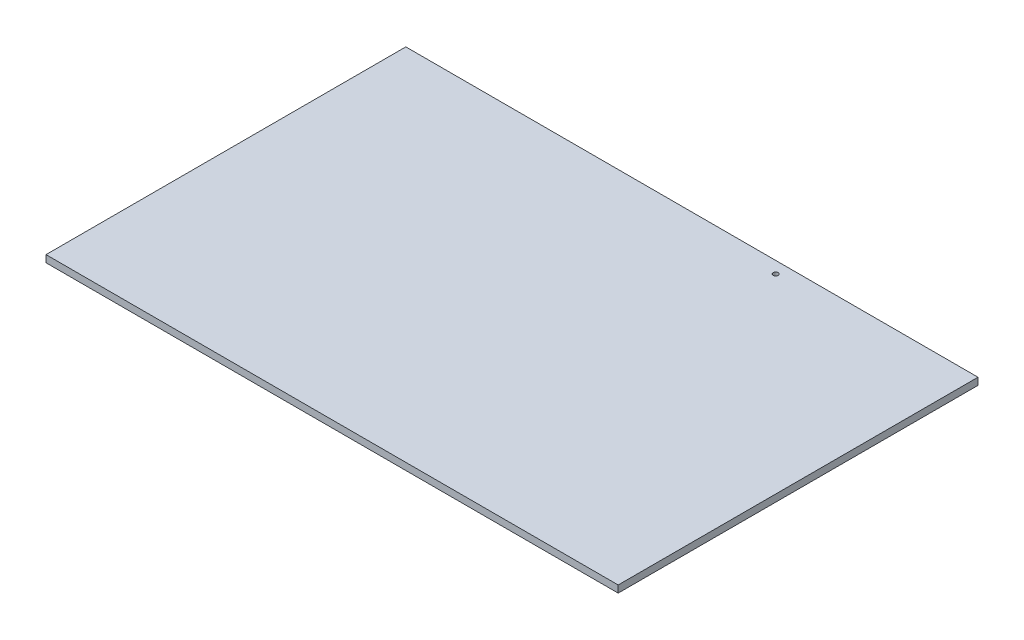
ISO-10303-21;
HEADER;
FILE_DESCRIPTION(('STEP AP214'),'2;1');
FILE_NAME('part.step','',(''),(''),'','','');
FILE_SCHEMA(('AUTOMOTIVE_DESIGN { 1 0 10303 214 1 1 1 1 }'));
ENDSEC;
DATA;
#1=APPLICATION_CONTEXT('core data for automotive mechanical design processes');
#2=APPLICATION_PROTOCOL_DEFINITION('international standard','automotive_design',2000,#1);
#3=PRODUCT_CONTEXT('',#1,'mechanical');
#4=PRODUCT('Part','Part','',(#3));
#5=PRODUCT_RELATED_PRODUCT_CATEGORY('part','',(#4));
#6=PRODUCT_DEFINITION_FORMATION('','',#4);
#7=PRODUCT_DEFINITION_CONTEXT('part definition',#1,'design');
#8=PRODUCT_DEFINITION('design','',#6,#7);
#9=PRODUCT_DEFINITION_SHAPE('','',#8);
#10=(LENGTH_UNIT() NAMED_UNIT(*) SI_UNIT(.MILLI.,.METRE.));
#11=(NAMED_UNIT(*) PLANE_ANGLE_UNIT() SI_UNIT($,.RADIAN.));
#12=(NAMED_UNIT(*) SI_UNIT($,.STERADIAN.) SOLID_ANGLE_UNIT());
#13=UNCERTAINTY_MEASURE_WITH_UNIT(LENGTH_MEASURE(1.E-05),#10,'distance_accuracy_value','');
#14=(GEOMETRIC_REPRESENTATION_CONTEXT(3) GLOBAL_UNCERTAINTY_ASSIGNED_CONTEXT((#13)) GLOBAL_UNIT_ASSIGNED_CONTEXT((#10,
#11,#12)) REPRESENTATION_CONTEXT('',''));
#15=CARTESIAN_POINT('',(0.,0.,0.));
#16=DIRECTION('',(0.,0.,1.));
#17=DIRECTION('',(1.,0.,0.));
#18=AXIS2_PLACEMENT_3D('',#15,#16,#17);
#19=CARTESIAN_POINT('',(-677.306733167082,12.,-361.633416458853));
#20=DIRECTION('',(1.,0.,0.));
#21=DIRECTION('',(0.,0.,-1.));
#22=AXIS2_PLACEMENT_3D('',#19,#20,#21);
#23=PLANE('',#22);
#24=DIRECTION('',(0.,0.,1.));
#25=VECTOR('',#24,1.);
#26=CARTESIAN_POINT('',(-677.306733167082,0.,-361.633416458853));
#27=LINE('',#26,#25);
#28=CARTESIAN_POINT('',(-677.306733167082,0.,-361.633416458853));
#29=VERTEX_POINT('',#28);
#30=CARTESIAN_POINT('',(-677.306733167082,0.,248.366583541147));
#31=VERTEX_POINT('',#30);
#32=EDGE_CURVE('E114',#29,#31,#27,.T.);
#33=ORIENTED_EDGE('',*,*,#32,.T.);
#34=DIRECTION('',(0.,-1.,0.));
#35=VECTOR('',#34,1.);
#36=CARTESIAN_POINT('',(-677.306733167082,12.,248.366583541147));
#37=LINE('',#36,#35);
#38=CARTESIAN_POINT('',(-677.306733167082,12.,248.366583541147));
#39=VERTEX_POINT('',#38);
#40=EDGE_CURVE('E11',#39,#31,#37,.T.);
#41=ORIENTED_EDGE('',*,*,#40,.F.);
#42=DIRECTION('',(0.,0.,1.));
#43=VECTOR('',#42,1.);
#44=CARTESIAN_POINT('',(-677.306733167082,12.,-361.633416458853));
#45=LINE('',#44,#43);
#46=CARTESIAN_POINT('',(-677.306733167082,12.,-361.633416458853));
#47=VERTEX_POINT('',#46);
#48=EDGE_CURVE('E102',#47,#39,#45,.T.);
#49=ORIENTED_EDGE('',*,*,#48,.F.);
#50=DIRECTION('',(0.,-1.,0.));
#51=VECTOR('',#50,1.);
#52=CARTESIAN_POINT('',(-677.306733167082,12.,-361.633416458853));
#53=LINE('',#52,#51);
#54=EDGE_CURVE('E110',#47,#29,#53,.T.);
#55=ORIENTED_EDGE('',*,*,#54,.T.);
#56=EDGE_LOOP('',(#33,#41,#49,#55));
#57=FACE_BOUND('',#56,.T.);
#58=ADVANCED_FACE('F51',(#57),#23,.F.);
#59=CARTESIAN_POINT('',(-677.306733167082,12.,248.366583541147));
#60=DIRECTION('',(0.,0.,-1.));
#61=DIRECTION('',(-1.,0.,0.));
#62=AXIS2_PLACEMENT_3D('',#59,#60,#61);
#63=PLANE('',#62);
#64=DIRECTION('',(1.,0.,0.));
#65=VECTOR('',#64,1.);
#66=CARTESIAN_POINT('',(-677.306733167082,0.,248.366583541147));
#67=LINE('',#66,#65);
#68=CARTESIAN_POINT('',(292.693266832918,0.,248.366583541147));
#69=VERTEX_POINT('',#68);
#70=EDGE_CURVE('E106',#31,#69,#67,.T.);
#71=ORIENTED_EDGE('',*,*,#70,.T.);
#72=DIRECTION('',(0.,-1.,0.));
#73=VECTOR('',#72,1.);
#74=CARTESIAN_POINT('',(292.693266832918,12.,248.366583541147));
#75=LINE('',#74,#73);
#76=CARTESIAN_POINT('',(292.693266832918,12.,248.366583541147));
#77=VERTEX_POINT('',#76);
#78=EDGE_CURVE('E59',#77,#69,#75,.T.);
#79=ORIENTED_EDGE('',*,*,#78,.F.);
#80=DIRECTION('',(1.,0.,0.));
#81=VECTOR('',#80,1.);
#82=CARTESIAN_POINT('',(-677.306733167082,12.,248.366583541147));
#83=LINE('',#82,#81);
#84=EDGE_CURVE('E97',#39,#77,#83,.T.);
#85=ORIENTED_EDGE('',*,*,#84,.F.);
#86=ORIENTED_EDGE('',*,*,#40,.T.);
#87=EDGE_LOOP('',(#71,#79,#85,#86));
#88=FACE_BOUND('',#87,.T.);
#89=ADVANCED_FACE('F105',(#88),#63,.F.);
#90=CARTESIAN_POINT('',(292.693266832918,12.,-361.633416458853));
#91=DIRECTION('',(-1.,0.,0.));
#92=DIRECTION('',(0.,0.,1.));
#93=AXIS2_PLACEMENT_3D('',#90,#91,#92);
#94=PLANE('',#93);
#95=DIRECTION('',(0.,0.,-1.));
#96=VECTOR('',#95,1.);
#97=CARTESIAN_POINT('',(292.693266832918,0.,-361.633416458853));
#98=LINE('',#97,#96);
#99=CARTESIAN_POINT('',(292.693266832918,0.,-361.633416458853));
#100=VERTEX_POINT('',#99);
#101=EDGE_CURVE('E84',#69,#100,#98,.T.);
#102=ORIENTED_EDGE('',*,*,#101,.T.);
#103=DIRECTION('',(0.,-1.,0.));
#104=VECTOR('',#103,1.);
#105=CARTESIAN_POINT('',(292.693266832918,12.,-361.633416458853));
#106=LINE('',#105,#104);
#107=CARTESIAN_POINT('',(292.693266832918,12.,-361.633416458853));
#108=VERTEX_POINT('',#107);
#109=EDGE_CURVE('E107',#108,#100,#106,.T.);
#110=ORIENTED_EDGE('',*,*,#109,.F.);
#111=DIRECTION('',(0.,0.,-1.));
#112=VECTOR('',#111,1.);
#113=CARTESIAN_POINT('',(292.693266832918,12.,-361.633416458853));
#114=LINE('',#113,#112);
#115=EDGE_CURVE('E100',#77,#108,#114,.T.);
#116=ORIENTED_EDGE('',*,*,#115,.F.);
#117=ORIENTED_EDGE('',*,*,#78,.T.);
#118=EDGE_LOOP('',(#102,#110,#116,#117));
#119=FACE_BOUND('',#118,.T.);
#120=ADVANCED_FACE('F108',(#119),#94,.F.);
#121=CARTESIAN_POINT('',(-677.306733167082,12.,-361.633416458853));
#122=DIRECTION('',(0.,0.,1.));
#123=DIRECTION('',(1.,0.,0.));
#124=AXIS2_PLACEMENT_3D('',#121,#122,#123);
#125=PLANE('',#124);
#126=DIRECTION('',(-1.,0.,0.));
#127=VECTOR('',#126,1.);
#128=CARTESIAN_POINT('',(-677.306733167082,0.,-361.633416458853));
#129=LINE('',#128,#127);
#130=EDGE_CURVE('E90',#100,#29,#129,.T.);
#131=ORIENTED_EDGE('',*,*,#130,.T.);
#132=ORIENTED_EDGE('',*,*,#54,.F.);
#133=DIRECTION('',(-1.,0.,0.));
#134=VECTOR('',#133,1.);
#135=CARTESIAN_POINT('',(-677.306733167082,12.,-361.633416458853));
#136=LINE('',#135,#134);
#137=EDGE_CURVE('E67',#108,#47,#136,.T.);
#138=ORIENTED_EDGE('',*,*,#137,.F.);
#139=ORIENTED_EDGE('',*,*,#109,.T.);
#140=EDGE_LOOP('',(#131,#132,#138,#139));
#141=FACE_BOUND('',#140,.T.);
#142=ADVANCED_FACE('F122',(#141),#125,.F.);
#143=CARTESIAN_POINT('',(0.,12.,0.));
#144=DIRECTION('',(0.,1.,0.));
#145=DIRECTION('',(0.,0.,1.));
#146=AXIS2_PLACEMENT_3D('',#143,#144,#145);
#147=PLANE('',#146);
#148=CARTESIAN_POINT('',(-30.2953740803998,12.,-341.62197439886));
#149=DIRECTION('',(0.,1.,0.));
#150=DIRECTION('',(0.,0.,1.));
#151=AXIS2_PLACEMENT_3D('',#148,#149,#150);
#152=CIRCLE('',#151,4.23387704696615);
#153=CARTESIAN_POINT('',(-30.2953740803998,12.,-337.388097351894));
#154=VERTEX_POINT('',#153);
#155=EDGE_CURVE('E128',#154,#154,#152,.T.);
#156=ORIENTED_EDGE('',*,*,#155,.F.);
#157=EDGE_LOOP('',(#156));
#158=FACE_BOUND('',#157,.T.);
#159=ORIENTED_EDGE('',*,*,#48,.T.);
#160=ORIENTED_EDGE('',*,*,#84,.T.);
#161=ORIENTED_EDGE('',*,*,#115,.T.);
#162=ORIENTED_EDGE('',*,*,#137,.T.);
#163=EDGE_LOOP('',(#159,#160,#161,#162));
#164=FACE_BOUND('',#163,.T.);
#165=ADVANCED_FACE('F98',(#158,#164),#147,.T.);
#166=CARTESIAN_POINT('',(0.,0.,0.));
#167=DIRECTION('',(0.,1.,0.));
#168=DIRECTION('',(0.,0.,1.));
#169=AXIS2_PLACEMENT_3D('',#166,#167,#168);
#170=PLANE('',#169);
#171=ORIENTED_EDGE('',*,*,#32,.F.);
#172=ORIENTED_EDGE('',*,*,#130,.F.);
#173=ORIENTED_EDGE('',*,*,#101,.F.);
#174=ORIENTED_EDGE('',*,*,#70,.F.);
#175=EDGE_LOOP('',(#171,#172,#173,#174));
#176=FACE_BOUND('',#175,.T.);
#177=ADVANCED_FACE('F125',(#176),#170,.F.);
#178=CARTESIAN_POINT('',(-30.2953740803998,2.,-341.62197439886));
#179=DIRECTION('',(0.,1.,0.));
#180=DIRECTION('',(0.,0.,1.));
#181=AXIS2_PLACEMENT_3D('',#178,#179,#180);
#182=CYLINDRICAL_SURFACE('',#181,4.23387704696615);
#183=CARTESIAN_POINT('',(-30.2953740803998,2.,-341.62197439886));
#184=DIRECTION('',(0.,1.,0.));
#185=DIRECTION('',(0.,0.,1.));
#186=AXIS2_PLACEMENT_3D('',#183,#184,#185);
#187=CIRCLE('',#186,4.23387704696615);
#188=CARTESIAN_POINT('',(-30.2953740803998,2.,-337.388097351894));
#189=VERTEX_POINT('',#188);
#190=EDGE_CURVE('E117',#189,#189,#187,.T.);
#191=ORIENTED_EDGE('',*,*,#190,.F.);
#192=EDGE_LOOP('',(#191));
#193=FACE_BOUND('',#192,.T.);
#194=ORIENTED_EDGE('',*,*,#155,.T.);
#195=EDGE_LOOP('',(#194));
#196=FACE_BOUND('',#195,.T.);
#197=ADVANCED_FACE('F136',(#193,#196),#182,.F.);
#198=CARTESIAN_POINT('',(-30.2953740803998,2.,-341.62197439886));
#199=DIRECTION('',(0.,1.,0.));
#200=DIRECTION('',(0.,0.,1.));
#201=AXIS2_PLACEMENT_3D('',#198,#199,#200);
#202=PLANE('',#201);
#203=ORIENTED_EDGE('',*,*,#190,.T.);
#204=EDGE_LOOP('',(#203));
#205=FACE_BOUND('',#204,.T.);
#206=ADVANCED_FACE('F134',(#205),#202,.T.);
#207=CLOSED_SHELL('',(#58,#89,#120,#142,#165,#177,#197,#206));
#208=MANIFOLD_SOLID_BREP('B2',#207);
#209=ADVANCED_BREP_SHAPE_REPRESENTATION('',(#18,#208),#14);
#210=SHAPE_DEFINITION_REPRESENTATION(#9,#209);
ENDSEC;
END-ISO-10303-21;
